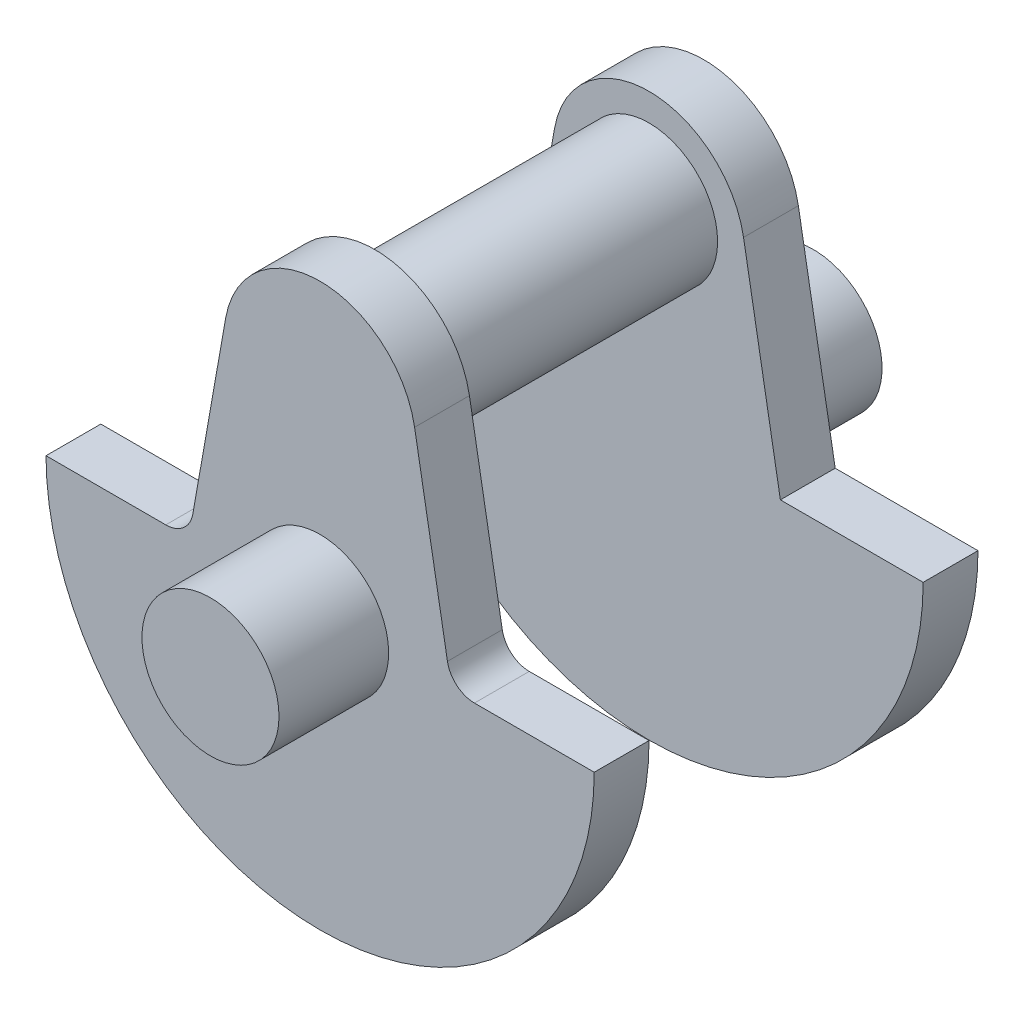
ISO-10303-21;
HEADER;
FILE_DESCRIPTION(('STEP AP214'),'2;1');
FILE_NAME('part.step','',(''),(''),'','','');
FILE_SCHEMA(('AUTOMOTIVE_DESIGN { 1 0 10303 214 1 1 1 1 }'));
ENDSEC;
DATA;
#1=APPLICATION_CONTEXT('core data for automotive mechanical design processes');
#2=APPLICATION_PROTOCOL_DEFINITION('international standard','automotive_design',2000,#1);
#3=PRODUCT_CONTEXT('',#1,'mechanical');
#4=PRODUCT('Part','Part','',(#3));
#5=PRODUCT_RELATED_PRODUCT_CATEGORY('part','',(#4));
#6=PRODUCT_DEFINITION_FORMATION('','',#4);
#7=PRODUCT_DEFINITION_CONTEXT('part definition',#1,'design');
#8=PRODUCT_DEFINITION('design','',#6,#7);
#9=PRODUCT_DEFINITION_SHAPE('','',#8);
#10=(LENGTH_UNIT() NAMED_UNIT(*) SI_UNIT(.MILLI.,.METRE.));
#11=(NAMED_UNIT(*) PLANE_ANGLE_UNIT() SI_UNIT($,.RADIAN.));
#12=(NAMED_UNIT(*) SI_UNIT($,.STERADIAN.) SOLID_ANGLE_UNIT());
#13=UNCERTAINTY_MEASURE_WITH_UNIT(LENGTH_MEASURE(1.E-05),#10,'distance_accuracy_value','');
#14=(GEOMETRIC_REPRESENTATION_CONTEXT(3) GLOBAL_UNCERTAINTY_ASSIGNED_CONTEXT((#13)) GLOBAL_UNIT_ASSIGNED_CONTEXT((#10,
#11,#12)) REPRESENTATION_CONTEXT('',''));
#15=CARTESIAN_POINT('',(0.,0.,0.));
#16=DIRECTION('',(0.,0.,1.));
#17=DIRECTION('',(1.,0.,0.));
#18=AXIS2_PLACEMENT_3D('',#15,#16,#17);
#19=CARTESIAN_POINT('',(0.,0.,20.));
#20=DIRECTION('',(0.,0.,-1.));
#21=DIRECTION('',(-1.,0.,0.));
#22=AXIS2_PLACEMENT_3D('',#19,#20,#21);
#23=CYLINDRICAL_SURFACE('',#22,12.5);
#24=CARTESIAN_POINT('',(0.,0.,20.));
#25=DIRECTION('',(0.,0.,1.));
#26=DIRECTION('',(1.,0.,0.));
#27=AXIS2_PLACEMENT_3D('',#24,#25,#26);
#28=CIRCLE('',#27,12.5);
#29=CARTESIAN_POINT('',(12.5,0.,20.));
#30=VERTEX_POINT('',#29);
#31=EDGE_CURVE('E280',#30,#30,#28,.T.);
#32=ORIENTED_EDGE('',*,*,#31,.F.);
#33=EDGE_LOOP('',(#32));
#34=FACE_BOUND('',#33,.T.);
#35=CARTESIAN_POINT('',(0.,0.,0.));
#36=DIRECTION('',(0.,0.,1.));
#37=DIRECTION('',(1.,0.,0.));
#38=AXIS2_PLACEMENT_3D('',#35,#36,#37);
#39=CIRCLE('',#38,12.5);
#40=CARTESIAN_POINT('',(12.5,0.,0.));
#41=VERTEX_POINT('',#40);
#42=EDGE_CURVE('E270',#41,#41,#39,.T.);
#43=ORIENTED_EDGE('',*,*,#42,.T.);
#44=EDGE_LOOP('',(#43));
#45=FACE_BOUND('',#44,.T.);
#46=ADVANCED_FACE('F39',(#34,#45),#23,.T.);
#47=CARTESIAN_POINT('',(0.,0.,20.));
#48=DIRECTION('',(0.,0.,1.));
#49=DIRECTION('',(1.,0.,0.));
#50=AXIS2_PLACEMENT_3D('',#47,#48,#49);
#51=PLANE('',#50);
#52=ORIENTED_EDGE('',*,*,#31,.T.);
#53=EDGE_LOOP('',(#52));
#54=FACE_BOUND('',#53,.T.);
#55=ADVANCED_FACE('F360',(#54),#51,.T.);
#56=CARTESIAN_POINT('',(0.,0.,-10.));
#57=DIRECTION('',(0.,0.,1.));
#58=DIRECTION('',(1.,0.,0.));
#59=AXIS2_PLACEMENT_3D('',#56,#57,#58);
#60=CYLINDRICAL_SURFACE('',#59,50.);
#61=CARTESIAN_POINT('',(0.,0.,0.));
#62=DIRECTION('',(0.,0.,1.));
#63=DIRECTION('',(1.,0.,0.));
#64=AXIS2_PLACEMENT_3D('',#61,#62,#63);
#65=CIRCLE('',#64,50.);
#66=CARTESIAN_POINT('',(-49.9999536591231,-0.0680741179953379,0.));
#67=VERTEX_POINT('',#66);
#68=CARTESIAN_POINT('',(49.9999536591231,-0.0680741179953257,0.));
#69=VERTEX_POINT('',#68);
#70=EDGE_CURVE('E222',#67,#69,#65,.T.);
#71=ORIENTED_EDGE('',*,*,#70,.F.);
#72=DIRECTION('',(0.,0.,1.));
#73=VECTOR('',#72,1.);
#74=CARTESIAN_POINT('',(-49.9999536591231,-0.0680741179953379,-10.));
#75=LINE('',#74,#73);
#76=CARTESIAN_POINT('',(-49.9999536591231,-0.0680741179953379,-10.));
#77=VERTEX_POINT('',#76);
#78=EDGE_CURVE('E266',#77,#67,#75,.T.);
#79=ORIENTED_EDGE('',*,*,#78,.F.);
#80=CARTESIAN_POINT('',(0.,0.,-10.));
#81=DIRECTION('',(0.,0.,1.));
#82=DIRECTION('',(1.,0.,0.));
#83=AXIS2_PLACEMENT_3D('',#80,#81,#82);
#84=CIRCLE('',#83,50.);
#85=CARTESIAN_POINT('',(49.9999536591231,-0.0680741179953257,-10.));
#86=VERTEX_POINT('',#85);
#87=EDGE_CURVE('E223',#77,#86,#84,.T.);
#88=ORIENTED_EDGE('',*,*,#87,.T.);
#89=DIRECTION('',(0.,0.,1.));
#90=VECTOR('',#89,1.);
#91=CARTESIAN_POINT('',(49.9999536591231,-0.0680741179953257,-10.));
#92=LINE('',#91,#90);
#93=EDGE_CURVE('E246',#86,#69,#92,.T.);
#94=ORIENTED_EDGE('',*,*,#93,.T.);
#95=EDGE_LOOP('',(#71,#79,#88,#94));
#96=FACE_BOUND('',#95,.T.);
#97=ADVANCED_FACE('F329',(#96),#60,.T.);
#98=CARTESIAN_POINT('',(-49.9999536591231,-0.0680741179953379,-10.));
#99=DIRECTION('',(0.,1.,0.));
#100=DIRECTION('',(-1.,0.,0.));
#101=AXIS2_PLACEMENT_3D('',#98,#99,#100);
#102=PLANE('',#101);
#103=DIRECTION('',(-1.,0.,0.));
#104=VECTOR('',#103,1.);
#105=CARTESIAN_POINT('',(-49.9999536591231,-0.0680741179953379,0.));
#106=LINE('',#105,#104);
#107=CARTESIAN_POINT('',(-28.1489114923737,-0.0680741179953379,0.));
#108=VERTEX_POINT('',#107);
#109=EDGE_CURVE('E228',#108,#67,#106,.T.);
#110=ORIENTED_EDGE('',*,*,#109,.F.);
#111=DIRECTION('',(0.,0.,1.));
#112=VECTOR('',#111,1.);
#113=CARTESIAN_POINT('',(-28.1489114923737,-0.0680741179953379,-10.));
#114=LINE('',#113,#112);
#115=CARTESIAN_POINT('',(-28.1489114923737,-0.0680741179953379,-10.));
#116=VERTEX_POINT('',#115);
#117=EDGE_CURVE('E291',#108,#116,#114,.F.);
#118=ORIENTED_EDGE('',*,*,#117,.T.);
#119=DIRECTION('',(-1.,0.,0.));
#120=VECTOR('',#119,1.);
#121=CARTESIAN_POINT('',(-49.9999536591231,-0.0680741179953379,-10.));
#122=LINE('',#121,#120);
#123=EDGE_CURVE('E243',#116,#77,#122,.T.);
#124=ORIENTED_EDGE('',*,*,#123,.T.);
#125=ORIENTED_EDGE('',*,*,#78,.T.);
#126=EDGE_LOOP('',(#110,#118,#124,#125));
#127=FACE_BOUND('',#126,.T.);
#128=ADVANCED_FACE('F333',(#127),#102,.T.);
#129=CARTESIAN_POINT('',(-17.2341356777137,38.0388431091713,-10.));
#130=DIRECTION('',(-0.984807753012208,0.17364817766693,0.));
#131=DIRECTION('',(-0.17364817766693,-0.984807753012208,0.));
#132=AXIS2_PLACEMENT_3D('',#129,#130,#131);
#133=PLANE('',#132);
#134=DIRECTION('',(-0.17364817766693,-0.984807753012208,0.));
#135=VECTOR('',#134,1.);
#136=CARTESIAN_POINT('',(-17.2341356777137,38.0388431091713,-10.));
#137=LINE('',#136,#135);
#138=CARTESIAN_POINT('',(-17.2341356777137,38.0388431091713,-10.));
#139=VERTEX_POINT('',#138);
#140=CARTESIAN_POINT('',(-23.2248727273127,4.06368499367,-10.));
#141=VERTEX_POINT('',#140);
#142=EDGE_CURVE('E239',#139,#141,#137,.T.);
#143=ORIENTED_EDGE('',*,*,#142,.T.);
#144=DIRECTION('',(0.,0.,1.));
#145=VECTOR('',#144,1.);
#146=CARTESIAN_POINT('',(-23.2248727273127,4.06368499367001,0.));
#147=LINE('',#146,#145);
#148=CARTESIAN_POINT('',(-23.2248727273127,4.06368499367,0.));
#149=VERTEX_POINT('',#148);
#150=EDGE_CURVE('E284',#141,#149,#147,.T.);
#151=ORIENTED_EDGE('',*,*,#150,.T.);
#152=DIRECTION('',(-0.17364817766693,-0.984807753012208,0.));
#153=VECTOR('',#152,1.);
#154=CARTESIAN_POINT('',(-17.2341356777137,38.0388431091713,0.));
#155=LINE('',#154,#153);
#156=CARTESIAN_POINT('',(-17.2341356777137,38.0388431091713,0.));
#157=VERTEX_POINT('',#156);
#158=EDGE_CURVE('E260',#157,#149,#155,.T.);
#159=ORIENTED_EDGE('',*,*,#158,.F.);
#160=DIRECTION('',(0.,0.,1.));
#161=VECTOR('',#160,1.);
#162=CARTESIAN_POINT('',(-17.2341356777137,38.0388431091713,-10.));
#163=LINE('',#162,#161);
#164=EDGE_CURVE('E271',#139,#157,#163,.T.);
#165=ORIENTED_EDGE('',*,*,#164,.F.);
#166=EDGE_LOOP('',(#143,#151,#159,#165));
#167=FACE_BOUND('',#166,.T.);
#168=ADVANCED_FACE('F341',(#167),#133,.T.);
#169=CARTESIAN_POINT('',(0.,35.,-10.));
#170=DIRECTION('',(0.,0.,1.));
#171=DIRECTION('',(1.,0.,0.));
#172=AXIS2_PLACEMENT_3D('',#169,#170,#171);
#173=CYLINDRICAL_SURFACE('',#172,17.5);
#174=CARTESIAN_POINT('',(0.,35.,0.));
#175=DIRECTION('',(0.,0.,1.));
#176=DIRECTION('',(1.,0.,0.));
#177=AXIS2_PLACEMENT_3D('',#174,#175,#176);
#178=CIRCLE('',#177,17.5);
#179=CARTESIAN_POINT('',(17.2341356777137,38.0388431091713,0.));
#180=VERTEX_POINT('',#179);
#181=EDGE_CURVE('E256',#180,#157,#178,.T.);
#182=ORIENTED_EDGE('',*,*,#181,.F.);
#183=DIRECTION('',(0.,0.,1.));
#184=VECTOR('',#183,1.);
#185=CARTESIAN_POINT('',(17.2341356777137,38.0388431091713,-10.));
#186=LINE('',#185,#184);
#187=CARTESIAN_POINT('',(17.2341356777137,38.0388431091713,-10.));
#188=VERTEX_POINT('',#187);
#189=EDGE_CURVE('E274',#188,#180,#186,.T.);
#190=ORIENTED_EDGE('',*,*,#189,.F.);
#191=CARTESIAN_POINT('',(0.,35.,-10.));
#192=DIRECTION('',(0.,0.,1.));
#193=DIRECTION('',(1.,0.,0.));
#194=AXIS2_PLACEMENT_3D('',#191,#192,#193);
#195=CIRCLE('',#194,17.5);
#196=EDGE_CURVE('E235',#188,#139,#195,.T.);
#197=ORIENTED_EDGE('',*,*,#196,.T.);
#198=ORIENTED_EDGE('',*,*,#164,.T.);
#199=EDGE_LOOP('',(#182,#190,#197,#198));
#200=FACE_BOUND('',#199,.T.);
#201=ADVANCED_FACE('F345',(#200),#173,.T.);
#202=CARTESIAN_POINT('',(17.2341356777137,38.0388431091713,-10.));
#203=DIRECTION('',(0.984807753012208,0.173648177666931,0.));
#204=DIRECTION('',(-0.173648177666931,0.984807753012208,0.));
#205=AXIS2_PLACEMENT_3D('',#202,#203,#204);
#206=PLANE('',#205);
#207=DIRECTION('',(-0.173648177666931,0.984807753012208,0.));
#208=VECTOR('',#207,1.);
#209=CARTESIAN_POINT('',(17.2341356777137,38.0388431091713,0.));
#210=LINE('',#209,#208);
#211=CARTESIAN_POINT('',(23.2248727273127,4.06368499367001,0.));
#212=VERTEX_POINT('',#211);
#213=EDGE_CURVE('E253',#212,#180,#210,.T.);
#214=ORIENTED_EDGE('',*,*,#213,.F.);
#215=DIRECTION('',(0.,0.,1.));
#216=VECTOR('',#215,1.);
#217=CARTESIAN_POINT('',(23.2248727273127,4.06368499367002,-10.));
#218=LINE('',#217,#216);
#219=CARTESIAN_POINT('',(23.2248727273127,4.06368499367001,-10.));
#220=VERTEX_POINT('',#219);
#221=EDGE_CURVE('E56',#212,#220,#218,.F.);
#222=ORIENTED_EDGE('',*,*,#221,.T.);
#223=DIRECTION('',(-0.173648177666931,0.984807753012208,0.));
#224=VECTOR('',#223,1.);
#225=CARTESIAN_POINT('',(17.2341356777137,38.0388431091713,-10.));
#226=LINE('',#225,#224);
#227=EDGE_CURVE('E232',#220,#188,#226,.T.);
#228=ORIENTED_EDGE('',*,*,#227,.T.);
#229=ORIENTED_EDGE('',*,*,#189,.T.);
#230=EDGE_LOOP('',(#214,#222,#228,#229));
#231=FACE_BOUND('',#230,.T.);
#232=ADVANCED_FACE('F350',(#231),#206,.T.);
#233=CARTESIAN_POINT('',(23.9534133364874,-0.0680741179953321,-10.));
#234=DIRECTION('',(0.,1.,0.));
#235=DIRECTION('',(-1.,0.,0.));
#236=AXIS2_PLACEMENT_3D('',#233,#234,#235);
#237=PLANE('',#236);
#238=DIRECTION('',(-1.,0.,0.));
#239=VECTOR('',#238,1.);
#240=CARTESIAN_POINT('',(23.9534133364874,-0.0680741179953321,-10.));
#241=LINE('',#240,#239);
#242=CARTESIAN_POINT('',(28.1489114923738,-0.068074117995331,-10.));
#243=VERTEX_POINT('',#242);
#244=EDGE_CURVE('E227',#86,#243,#241,.T.);
#245=ORIENTED_EDGE('',*,*,#244,.T.);
#246=DIRECTION('',(0.,0.,1.));
#247=VECTOR('',#246,1.);
#248=CARTESIAN_POINT('',(28.1489114923738,-0.0680741179953309,0.));
#249=LINE('',#248,#247);
#250=CARTESIAN_POINT('',(28.1489114923738,-0.068074117995331,0.));
#251=VERTEX_POINT('',#250);
#252=EDGE_CURVE('E294',#243,#251,#249,.T.);
#253=ORIENTED_EDGE('',*,*,#252,.T.);
#254=DIRECTION('',(-1.,0.,0.));
#255=VECTOR('',#254,1.);
#256=CARTESIAN_POINT('',(23.9534133364874,-0.0680741179953321,0.));
#257=LINE('',#256,#255);
#258=EDGE_CURVE('E250',#69,#251,#257,.T.);
#259=ORIENTED_EDGE('',*,*,#258,.F.);
#260=ORIENTED_EDGE('',*,*,#93,.F.);
#261=EDGE_LOOP('',(#245,#253,#259,#260));
#262=FACE_BOUND('',#261,.T.);
#263=ADVANCED_FACE('F321',(#262),#237,.T.);
#264=CARTESIAN_POINT('',(0.,0.,-10.));
#265=DIRECTION('',(0.,0.,1.));
#266=DIRECTION('',(1.,0.,0.));
#267=AXIS2_PLACEMENT_3D('',#264,#265,#266);
#268=PLANE('',#267);
#269=CARTESIAN_POINT('',(0.,35.,-10.));
#270=DIRECTION('',(0.,0.,1.));
#271=DIRECTION('',(1.,0.,0.));
#272=AXIS2_PLACEMENT_3D('',#269,#270,#271);
#273=CIRCLE('',#272,12.5);
#274=CARTESIAN_POINT('',(12.5,35.,-10.));
#275=VERTEX_POINT('',#274);
#276=EDGE_CURVE('E43',#275,#275,#273,.F.);
#277=ORIENTED_EDGE('',*,*,#276,.F.);
#278=EDGE_LOOP('',(#277));
#279=FACE_BOUND('',#278,.T.);
#280=ORIENTED_EDGE('',*,*,#87,.F.);
#281=ORIENTED_EDGE('',*,*,#123,.F.);
#282=CARTESIAN_POINT('',(-28.1489114923737,4.93192588200466,-10.));
#283=DIRECTION('',(0.,0.,1.));
#284=DIRECTION('',(1.,0.,0.));
#285=AXIS2_PLACEMENT_3D('',#282,#283,#284);
#286=CIRCLE('',#285,5.);
#287=EDGE_CURVE('E303',#116,#141,#286,.T.);
#288=ORIENTED_EDGE('',*,*,#287,.T.);
#289=ORIENTED_EDGE('',*,*,#142,.F.);
#290=ORIENTED_EDGE('',*,*,#196,.F.);
#291=ORIENTED_EDGE('',*,*,#227,.F.);
#292=CARTESIAN_POINT('',(28.1489114923738,4.93192588200467,-10.));
#293=DIRECTION('',(0.,0.,1.));
#294=DIRECTION('',(1.,0.,0.));
#295=AXIS2_PLACEMENT_3D('',#292,#293,#294);
#296=CIRCLE('',#295,5.);
#297=EDGE_CURVE('E307',#220,#243,#296,.T.);
#298=ORIENTED_EDGE('',*,*,#297,.T.);
#299=ORIENTED_EDGE('',*,*,#244,.F.);
#300=EDGE_LOOP('',(#280,#281,#288,#289,#290,#291,#298,#299));
#301=FACE_BOUND('',#300,.T.);
#302=ADVANCED_FACE('F318',(#279,#301),#268,.F.);
#303=CARTESIAN_POINT('',(0.,0.,0.));
#304=DIRECTION('',(0.,0.,1.));
#305=DIRECTION('',(1.,0.,0.));
#306=AXIS2_PLACEMENT_3D('',#303,#304,#305);
#307=PLANE('',#306);
#308=ORIENTED_EDGE('',*,*,#42,.F.);
#309=EDGE_LOOP('',(#308));
#310=FACE_BOUND('',#309,.T.);
#311=ORIENTED_EDGE('',*,*,#70,.T.);
#312=ORIENTED_EDGE('',*,*,#258,.T.);
#313=CARTESIAN_POINT('',(28.1489114923738,4.93192588200467,0.));
#314=DIRECTION('',(0.,0.,1.));
#315=DIRECTION('',(1.,0.,0.));
#316=AXIS2_PLACEMENT_3D('',#313,#314,#315);
#317=CIRCLE('',#316,5.);
#318=EDGE_CURVE('E64',#251,#212,#317,.F.);
#319=ORIENTED_EDGE('',*,*,#318,.T.);
#320=ORIENTED_EDGE('',*,*,#213,.T.);
#321=ORIENTED_EDGE('',*,*,#181,.T.);
#322=ORIENTED_EDGE('',*,*,#158,.T.);
#323=CARTESIAN_POINT('',(-28.1489114923737,4.93192588200466,0.));
#324=DIRECTION('',(0.,0.,1.));
#325=DIRECTION('',(1.,0.,0.));
#326=AXIS2_PLACEMENT_3D('',#323,#324,#325);
#327=CIRCLE('',#326,5.);
#328=EDGE_CURVE('E300',#149,#108,#327,.F.);
#329=ORIENTED_EDGE('',*,*,#328,.T.);
#330=ORIENTED_EDGE('',*,*,#109,.T.);
#331=EDGE_LOOP('',(#311,#312,#319,#320,#321,#322,#329,#330));
#332=FACE_BOUND('',#331,.T.);
#333=ADVANCED_FACE('F320',(#310,#332),#307,.T.);
#334=CARTESIAN_POINT('',(-28.1489114923737,4.93192588200466,-10.));
#335=DIRECTION('',(0.,0.,-1.));
#336=DIRECTION('',(-1.,0.,0.));
#337=AXIS2_PLACEMENT_3D('',#334,#335,#336);
#338=CYLINDRICAL_SURFACE('',#337,5.);
#339=ORIENTED_EDGE('',*,*,#287,.F.);
#340=ORIENTED_EDGE('',*,*,#117,.F.);
#341=ORIENTED_EDGE('',*,*,#328,.F.);
#342=ORIENTED_EDGE('',*,*,#150,.F.);
#343=EDGE_LOOP('',(#339,#340,#341,#342));
#344=FACE_BOUND('',#343,.T.);
#345=ADVANCED_FACE('F336',(#344),#338,.F.);
#346=CARTESIAN_POINT('',(28.1489114923738,4.93192588200467,-10.));
#347=DIRECTION('',(0.,0.,-1.));
#348=DIRECTION('',(-1.,0.,0.));
#349=AXIS2_PLACEMENT_3D('',#346,#347,#348);
#350=CYLINDRICAL_SURFACE('',#349,5.);
#351=ORIENTED_EDGE('',*,*,#297,.F.);
#352=ORIENTED_EDGE('',*,*,#221,.F.);
#353=ORIENTED_EDGE('',*,*,#318,.F.);
#354=ORIENTED_EDGE('',*,*,#252,.F.);
#355=EDGE_LOOP('',(#351,#352,#353,#354));
#356=FACE_BOUND('',#355,.T.);
#357=ADVANCED_FACE('F41',(#356),#350,.F.);
#358=CARTESIAN_POINT('',(0.,35.,-60.));
#359=DIRECTION('',(0.,0.,1.));
#360=DIRECTION('',(1.,0.,0.));
#361=AXIS2_PLACEMENT_3D('',#358,#359,#360);
#362=CYLINDRICAL_SURFACE('',#361,12.5);
#363=CARTESIAN_POINT('',(0.,35.,-60.));
#364=DIRECTION('',(0.,0.,-1.));
#365=DIRECTION('',(-1.,0.,0.));
#366=AXIS2_PLACEMENT_3D('',#363,#364,#365);
#367=CIRCLE('',#366,12.5);
#368=CARTESIAN_POINT('',(-12.5,35.,-60.));
#369=VERTEX_POINT('',#368);
#370=EDGE_CURVE('E204',#369,#369,#367,.T.);
#371=ORIENTED_EDGE('',*,*,#370,.F.);
#372=EDGE_LOOP('',(#371));
#373=FACE_BOUND('',#372,.T.);
#374=ORIENTED_EDGE('',*,*,#276,.T.);
#375=EDGE_LOOP('',(#374));
#376=FACE_BOUND('',#375,.T.);
#377=ADVANCED_FACE('F316',(#373,#376),#362,.T.);
#378=CARTESIAN_POINT('',(0.,0.,-60.));
#379=DIRECTION('',(0.,0.,-1.));
#380=DIRECTION('',(-1.,0.,0.));
#381=AXIS2_PLACEMENT_3D('',#378,#379,#380);
#382=CYLINDRICAL_SURFACE('',#381,50.);
#383=CARTESIAN_POINT('',(0.,0.,-70.));
#384=DIRECTION('',(0.,0.,1.));
#385=DIRECTION('',(1.,0.,0.));
#386=AXIS2_PLACEMENT_3D('',#383,#384,#385);
#387=CIRCLE('',#386,50.);
#388=CARTESIAN_POINT('',(-49.9999536591231,-0.0680741179953379,-70.));
#389=VERTEX_POINT('',#388);
#390=CARTESIAN_POINT('',(49.9999536591231,-0.0680741179953257,-70.));
#391=VERTEX_POINT('',#390);
#392=EDGE_CURVE('E188',#389,#391,#387,.T.);
#393=ORIENTED_EDGE('',*,*,#392,.T.);
#394=DIRECTION('',(0.,0.,-1.));
#395=VECTOR('',#394,1.);
#396=CARTESIAN_POINT('',(49.9999536591231,-0.0680741179953257,-60.));
#397=LINE('',#396,#395);
#398=CARTESIAN_POINT('',(49.9999536591231,-0.0680741179953257,-60.));
#399=VERTEX_POINT('',#398);
#400=EDGE_CURVE('E169',#399,#391,#397,.T.);
#401=ORIENTED_EDGE('',*,*,#400,.F.);
#402=CARTESIAN_POINT('',(0.,0.,-60.));
#403=DIRECTION('',(0.,0.,1.));
#404=DIRECTION('',(1.,0.,0.));
#405=AXIS2_PLACEMENT_3D('',#402,#403,#404);
#406=CIRCLE('',#405,50.);
#407=CARTESIAN_POINT('',(-49.9999536591231,-0.0680741179953379,-60.));
#408=VERTEX_POINT('',#407);
#409=EDGE_CURVE('E146',#408,#399,#406,.T.);
#410=ORIENTED_EDGE('',*,*,#409,.F.);
#411=DIRECTION('',(0.,0.,-1.));
#412=VECTOR('',#411,1.);
#413=CARTESIAN_POINT('',(-49.9999536591231,-0.0680741179953379,-60.));
#414=LINE('',#413,#412);
#415=EDGE_CURVE('E156',#408,#389,#414,.T.);
#416=ORIENTED_EDGE('',*,*,#415,.T.);
#417=EDGE_LOOP('',(#393,#401,#410,#416));
#418=FACE_BOUND('',#417,.T.);
#419=ADVANCED_FACE('F167',(#418),#382,.T.);
#420=CARTESIAN_POINT('',(23.9534133364874,-0.0680741179953321,-60.));
#421=DIRECTION('',(0.,-1.,0.));
#422=DIRECTION('',(1.,0.,0.));
#423=AXIS2_PLACEMENT_3D('',#420,#421,#422);
#424=PLANE('',#423);
#425=DIRECTION('',(-1.,0.,0.));
#426=VECTOR('',#425,1.);
#427=CARTESIAN_POINT('',(23.9534133364874,-0.0680741179953321,-70.));
#428=LINE('',#427,#426);
#429=CARTESIAN_POINT('',(23.9534133364874,-0.0680741179953321,-70.));
#430=VERTEX_POINT('',#429);
#431=EDGE_CURVE('E171',#391,#430,#428,.T.);
#432=ORIENTED_EDGE('',*,*,#431,.T.);
#433=DIRECTION('',(0.,0.,-1.));
#434=VECTOR('',#433,1.);
#435=CARTESIAN_POINT('',(23.9534133364874,-0.0680741179953321,-60.));
#436=LINE('',#435,#434);
#437=CARTESIAN_POINT('',(23.9534133364874,-0.0680741179953321,-60.));
#438=VERTEX_POINT('',#437);
#439=EDGE_CURVE('E205',#438,#430,#436,.T.);
#440=ORIENTED_EDGE('',*,*,#439,.F.);
#441=DIRECTION('',(-1.,0.,0.));
#442=VECTOR('',#441,1.);
#443=CARTESIAN_POINT('',(23.9534133364874,-0.0680741179953321,-60.));
#444=LINE('',#443,#442);
#445=EDGE_CURVE('E165',#399,#438,#444,.T.);
#446=ORIENTED_EDGE('',*,*,#445,.F.);
#447=ORIENTED_EDGE('',*,*,#400,.T.);
#448=EDGE_LOOP('',(#432,#440,#446,#447));
#449=FACE_BOUND('',#448,.T.);
#450=ADVANCED_FACE('F461',(#449),#424,.F.);
#451=CARTESIAN_POINT('',(17.2341356777137,38.0388431091713,-60.));
#452=DIRECTION('',(-0.984807753012208,-0.173648177666931,0.));
#453=DIRECTION('',(0.173648177666931,-0.984807753012208,0.));
#454=AXIS2_PLACEMENT_3D('',#451,#452,#453);
#455=PLANE('',#454);
#456=DIRECTION('',(-0.173648177666931,0.984807753012208,0.));
#457=VECTOR('',#456,1.);
#458=CARTESIAN_POINT('',(17.2341356777137,38.0388431091713,-70.));
#459=LINE('',#458,#457);
#460=CARTESIAN_POINT('',(17.2341356777137,38.0388431091713,-70.));
#461=VERTEX_POINT('',#460);
#462=EDGE_CURVE('E174',#430,#461,#459,.T.);
#463=ORIENTED_EDGE('',*,*,#462,.T.);
#464=DIRECTION('',(0.,0.,-1.));
#465=VECTOR('',#464,1.);
#466=CARTESIAN_POINT('',(17.2341356777137,38.0388431091713,-60.));
#467=LINE('',#466,#465);
#468=CARTESIAN_POINT('',(17.2341356777137,38.0388431091713,-60.));
#469=VERTEX_POINT('',#468);
#470=EDGE_CURVE('E209',#469,#461,#467,.T.);
#471=ORIENTED_EDGE('',*,*,#470,.F.);
#472=DIRECTION('',(-0.173648177666931,0.984807753012208,0.));
#473=VECTOR('',#472,1.);
#474=CARTESIAN_POINT('',(17.2341356777137,38.0388431091713,-60.));
#475=LINE('',#474,#473);
#476=EDGE_CURVE('E183',#438,#469,#475,.T.);
#477=ORIENTED_EDGE('',*,*,#476,.F.);
#478=ORIENTED_EDGE('',*,*,#439,.T.);
#479=EDGE_LOOP('',(#463,#471,#477,#478));
#480=FACE_BOUND('',#479,.T.);
#481=ADVANCED_FACE('F469',(#480),#455,.F.);
#482=CARTESIAN_POINT('',(0.,35.,-60.));
#483=DIRECTION('',(0.,0.,-1.));
#484=DIRECTION('',(-1.,0.,0.));
#485=AXIS2_PLACEMENT_3D('',#482,#483,#484);
#486=CYLINDRICAL_SURFACE('',#485,17.5);
#487=CARTESIAN_POINT('',(0.,35.,-70.));
#488=DIRECTION('',(0.,0.,1.));
#489=DIRECTION('',(1.,0.,0.));
#490=AXIS2_PLACEMENT_3D('',#487,#488,#489);
#491=CIRCLE('',#490,17.5);
#492=CARTESIAN_POINT('',(-17.2341356777137,38.0388431091713,-70.));
#493=VERTEX_POINT('',#492);
#494=EDGE_CURVE('E197',#461,#493,#491,.T.);
#495=ORIENTED_EDGE('',*,*,#494,.T.);
#496=DIRECTION('',(0.,0.,-1.));
#497=VECTOR('',#496,1.);
#498=CARTESIAN_POINT('',(-17.2341356777137,38.0388431091713,-60.));
#499=LINE('',#498,#497);
#500=CARTESIAN_POINT('',(-17.2341356777137,38.0388431091713,-60.));
#501=VERTEX_POINT('',#500);
#502=EDGE_CURVE('E213',#501,#493,#499,.T.);
#503=ORIENTED_EDGE('',*,*,#502,.F.);
#504=CARTESIAN_POINT('',(0.,35.,-60.));
#505=DIRECTION('',(0.,0.,1.));
#506=DIRECTION('',(1.,0.,0.));
#507=AXIS2_PLACEMENT_3D('',#504,#505,#506);
#508=CIRCLE('',#507,17.5);
#509=EDGE_CURVE('E180',#469,#501,#508,.T.);
#510=ORIENTED_EDGE('',*,*,#509,.F.);
#511=ORIENTED_EDGE('',*,*,#470,.T.);
#512=EDGE_LOOP('',(#495,#503,#510,#511));
#513=FACE_BOUND('',#512,.T.);
#514=ADVANCED_FACE('F478',(#513),#486,.T.);
#515=CARTESIAN_POINT('',(-17.2341356777137,38.0388431091713,-60.));
#516=DIRECTION('',(0.984807753012208,-0.17364817766693,0.));
#517=DIRECTION('',(0.17364817766693,0.984807753012208,0.));
#518=AXIS2_PLACEMENT_3D('',#515,#516,#517);
#519=PLANE('',#518);
#520=DIRECTION('',(-0.17364817766693,-0.984807753012208,0.));
#521=VECTOR('',#520,1.);
#522=CARTESIAN_POINT('',(-17.2341356777137,38.0388431091713,-70.));
#523=LINE('',#522,#521);
#524=CARTESIAN_POINT('',(-23.9534133364873,-0.0680741179953379,-70.));
#525=VERTEX_POINT('',#524);
#526=EDGE_CURVE('E194',#493,#525,#523,.T.);
#527=ORIENTED_EDGE('',*,*,#526,.T.);
#528=DIRECTION('',(0.,0.,-1.));
#529=VECTOR('',#528,1.);
#530=CARTESIAN_POINT('',(-23.9534133364873,-0.0680741179953379,-60.));
#531=LINE('',#530,#529);
#532=CARTESIAN_POINT('',(-23.9534133364873,-0.0680741179953379,-60.));
#533=VERTEX_POINT('',#532);
#534=EDGE_CURVE('E164',#533,#525,#531,.T.);
#535=ORIENTED_EDGE('',*,*,#534,.F.);
#536=DIRECTION('',(-0.17364817766693,-0.984807753012208,0.));
#537=VECTOR('',#536,1.);
#538=CARTESIAN_POINT('',(-17.2341356777137,38.0388431091713,-60.));
#539=LINE('',#538,#537);
#540=EDGE_CURVE('E149',#501,#533,#539,.T.);
#541=ORIENTED_EDGE('',*,*,#540,.F.);
#542=ORIENTED_EDGE('',*,*,#502,.T.);
#543=EDGE_LOOP('',(#527,#535,#541,#542));
#544=FACE_BOUND('',#543,.T.);
#545=ADVANCED_FACE('F487',(#544),#519,.F.);
#546=CARTESIAN_POINT('',(-49.9999536591231,-0.0680741179953379,-60.));
#547=DIRECTION('',(0.,-1.,0.));
#548=DIRECTION('',(1.,0.,0.));
#549=AXIS2_PLACEMENT_3D('',#546,#547,#548);
#550=PLANE('',#549);
#551=DIRECTION('',(-1.,0.,0.));
#552=VECTOR('',#551,1.);
#553=CARTESIAN_POINT('',(-49.9999536591231,-0.0680741179953379,-70.));
#554=LINE('',#553,#552);
#555=EDGE_CURVE('E159',#525,#389,#554,.T.);
#556=ORIENTED_EDGE('',*,*,#555,.T.);
#557=ORIENTED_EDGE('',*,*,#415,.F.);
#558=DIRECTION('',(-1.,0.,0.));
#559=VECTOR('',#558,1.);
#560=CARTESIAN_POINT('',(-49.9999536591231,-0.0680741179953379,-60.));
#561=LINE('',#560,#559);
#562=EDGE_CURVE('E142',#533,#408,#561,.T.);
#563=ORIENTED_EDGE('',*,*,#562,.F.);
#564=ORIENTED_EDGE('',*,*,#534,.T.);
#565=EDGE_LOOP('',(#556,#557,#563,#564));
#566=FACE_BOUND('',#565,.T.);
#567=ADVANCED_FACE('F157',(#566),#550,.F.);
#568=CARTESIAN_POINT('',(0.,0.,-60.));
#569=DIRECTION('',(0.,0.,-1.));
#570=DIRECTION('',(1.,0.,0.));
#571=AXIS2_PLACEMENT_3D('',#568,#569,#570);
#572=PLANE('',#571);
#573=ORIENTED_EDGE('',*,*,#370,.T.);
#574=EDGE_LOOP('',(#573));
#575=FACE_BOUND('',#574,.T.);
#576=ORIENTED_EDGE('',*,*,#409,.T.);
#577=ORIENTED_EDGE('',*,*,#445,.T.);
#578=ORIENTED_EDGE('',*,*,#476,.T.);
#579=ORIENTED_EDGE('',*,*,#509,.T.);
#580=ORIENTED_EDGE('',*,*,#540,.T.);
#581=ORIENTED_EDGE('',*,*,#562,.T.);
#582=EDGE_LOOP('',(#576,#577,#578,#579,#580,#581));
#583=FACE_BOUND('',#582,.T.);
#584=ADVANCED_FACE('F144',(#575,#583),#572,.F.);
#585=CARTESIAN_POINT('',(0.,0.,-70.));
#586=DIRECTION('',(0.,0.,-1.));
#587=DIRECTION('',(1.,0.,0.));
#588=AXIS2_PLACEMENT_3D('',#585,#586,#587);
#589=PLANE('',#588);
#590=CARTESIAN_POINT('',(0.,0.,-70.));
#591=DIRECTION('',(0.,0.,-1.));
#592=DIRECTION('',(-1.,0.,0.));
#593=AXIS2_PLACEMENT_3D('',#590,#591,#592);
#594=CIRCLE('',#593,12.5);
#595=CARTESIAN_POINT('',(-12.5,0.,-70.));
#596=VERTEX_POINT('',#595);
#597=EDGE_CURVE('E11',#596,#596,#594,.T.);
#598=ORIENTED_EDGE('',*,*,#597,.F.);
#599=EDGE_LOOP('',(#598));
#600=FACE_BOUND('',#599,.T.);
#601=ORIENTED_EDGE('',*,*,#392,.F.);
#602=ORIENTED_EDGE('',*,*,#555,.F.);
#603=ORIENTED_EDGE('',*,*,#526,.F.);
#604=ORIENTED_EDGE('',*,*,#494,.F.);
#605=ORIENTED_EDGE('',*,*,#462,.F.);
#606=ORIENTED_EDGE('',*,*,#431,.F.);
#607=EDGE_LOOP('',(#601,#602,#603,#604,#605,#606));
#608=FACE_BOUND('',#607,.T.);
#609=ADVANCED_FACE('F511',(#600,#608),#589,.T.);
#610=CARTESIAN_POINT('',(0.,0.,-90.));
#611=DIRECTION('',(0.,0.,1.));
#612=DIRECTION('',(1.,0.,0.));
#613=AXIS2_PLACEMENT_3D('',#610,#611,#612);
#614=CYLINDRICAL_SURFACE('',#613,12.5);
#615=CARTESIAN_POINT('',(0.,0.,-90.));
#616=DIRECTION('',(0.,0.,-1.));
#617=DIRECTION('',(-1.,0.,0.));
#618=AXIS2_PLACEMENT_3D('',#615,#616,#617);
#619=CIRCLE('',#618,12.5);
#620=CARTESIAN_POINT('',(-12.5,0.,-90.));
#621=VERTEX_POINT('',#620);
#622=EDGE_CURVE('E191',#621,#621,#619,.T.);
#623=ORIENTED_EDGE('',*,*,#622,.F.);
#624=EDGE_LOOP('',(#623));
#625=FACE_BOUND('',#624,.T.);
#626=ORIENTED_EDGE('',*,*,#597,.T.);
#627=EDGE_LOOP('',(#626));
#628=FACE_BOUND('',#627,.T.);
#629=ADVANCED_FACE('F520',(#625,#628),#614,.T.);
#630=CARTESIAN_POINT('',(0.,0.,-90.));
#631=DIRECTION('',(0.,0.,-1.));
#632=DIRECTION('',(-1.,0.,0.));
#633=AXIS2_PLACEMENT_3D('',#630,#631,#632);
#634=PLANE('',#633);
#635=ORIENTED_EDGE('',*,*,#622,.T.);
#636=EDGE_LOOP('',(#635));
#637=FACE_BOUND('',#636,.T.);
#638=ADVANCED_FACE('F529',(#637),#634,.T.);
#639=CLOSED_SHELL('',(#46,#55,#97,#128,#168,#201,#232,#263,#302,#333,#345,#357,#377,#419,#450,
#481,#514,#545,#567,#584,#609,#629,#638));
#640=MANIFOLD_SOLID_BREP('B2',#639);
#641=ADVANCED_BREP_SHAPE_REPRESENTATION('',(#18,#640),#14);
#642=SHAPE_DEFINITION_REPRESENTATION(#9,#641);
ENDSEC;
END-ISO-10303-21;
